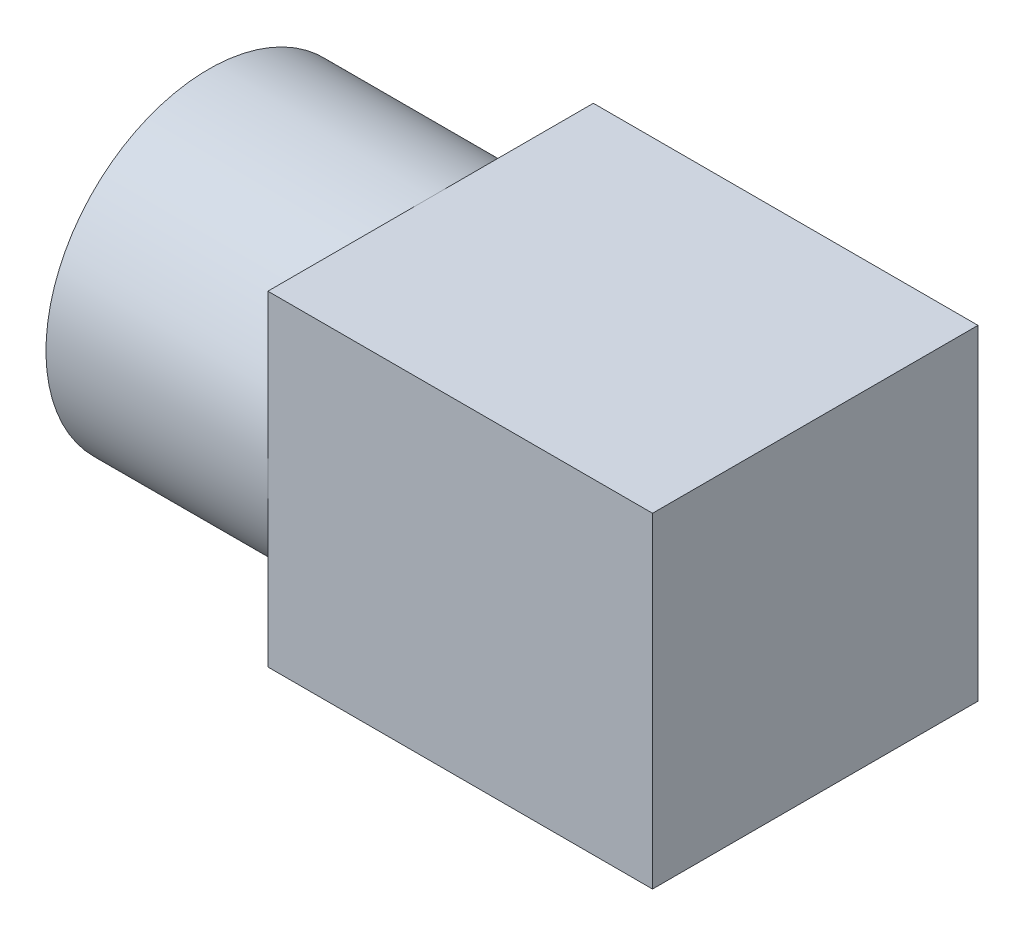
ISO-10303-21;
HEADER;
FILE_DESCRIPTION(('STEP AP214'),'2;1');
FILE_NAME('part.step','',(''),(''),'','','');
FILE_SCHEMA(('AUTOMOTIVE_DESIGN { 1 0 10303 214 1 1 1 1 }'));
ENDSEC;
DATA;
#1=APPLICATION_CONTEXT('core data for automotive mechanical design processes');
#2=APPLICATION_PROTOCOL_DEFINITION('international standard','automotive_design',2000,#1);
#3=PRODUCT_CONTEXT('',#1,'mechanical');
#4=PRODUCT('Part','Part','',(#3));
#5=PRODUCT_RELATED_PRODUCT_CATEGORY('part','',(#4));
#6=PRODUCT_DEFINITION_FORMATION('','',#4);
#7=PRODUCT_DEFINITION_CONTEXT('part definition',#1,'design');
#8=PRODUCT_DEFINITION('design','',#6,#7);
#9=PRODUCT_DEFINITION_SHAPE('','',#8);
#10=(LENGTH_UNIT() NAMED_UNIT(*) SI_UNIT(.MILLI.,.METRE.));
#11=(NAMED_UNIT(*) PLANE_ANGLE_UNIT() SI_UNIT($,.RADIAN.));
#12=(NAMED_UNIT(*) SI_UNIT($,.STERADIAN.) SOLID_ANGLE_UNIT());
#13=UNCERTAINTY_MEASURE_WITH_UNIT(LENGTH_MEASURE(1.E-05),#10,'distance_accuracy_value','');
#14=(GEOMETRIC_REPRESENTATION_CONTEXT(3) GLOBAL_UNCERTAINTY_ASSIGNED_CONTEXT((#13)) GLOBAL_UNIT_ASSIGNED_CONTEXT((#10,
#11,#12)) REPRESENTATION_CONTEXT('',''));
#15=CARTESIAN_POINT('',(0.,0.,0.));
#16=DIRECTION('',(0.,0.,1.));
#17=DIRECTION('',(1.,0.,0.));
#18=AXIS2_PLACEMENT_3D('',#15,#16,#17);
#19=CARTESIAN_POINT('',(159.831144743786,87.6716742459515,126.819588846238));
#20=DIRECTION('',(-1.,0.,0.));
#21=DIRECTION('',(0.,0.,1.));
#22=AXIS2_PLACEMENT_3D('',#19,#20,#21);
#23=PLANE('',#22);
#24=DIRECTION('',(0.,0.,-1.));
#25=VECTOR('',#24,1.);
#26=CARTESIAN_POINT('',(159.831144743785,109.671674245952,148.819588846238));
#27=LINE('',#26,#25);
#28=CARTESIAN_POINT('',(159.831144743785,109.671674245952,148.819588846238));
#29=VERTEX_POINT('',#28);
#30=CARTESIAN_POINT('',(159.831144743785,109.671674245952,137.819588846238));
#31=VERTEX_POINT('',#30);
#32=EDGE_CURVE('E132',#29,#31,#27,.T.);
#33=ORIENTED_EDGE('',*,*,#32,.T.);
#34=CARTESIAN_POINT('',(159.831144743785,98.6716742459516,137.819588846238));
#35=DIRECTION('',(1.,0.,0.));
#36=DIRECTION('',(0.,1.,0.));
#37=AXIS2_PLACEMENT_3D('',#34,#35,#36);
#38=CIRCLE('',#37,11.);
#39=CARTESIAN_POINT('',(159.831144743785,98.6716742459517,148.819588846238));
#40=VERTEX_POINT('',#39);
#41=EDGE_CURVE('E69',#31,#40,#38,.T.);
#42=ORIENTED_EDGE('',*,*,#41,.T.);
#43=DIRECTION('',(0.,1.,0.));
#44=VECTOR('',#43,1.);
#45=CARTESIAN_POINT('',(159.831144743785,87.6716742459517,148.819588846238));
#46=LINE('',#45,#44);
#47=EDGE_CURVE('E129',#40,#29,#46,.T.);
#48=ORIENTED_EDGE('',*,*,#47,.T.);
#49=EDGE_LOOP('',(#33,#42,#48));
#50=FACE_BOUND('',#49,.T.);
#51=ADVANCED_FACE('F57',(#50),#23,.T.);
#52=CARTESIAN_POINT('',(159.831144743785,87.6716742459517,148.819588846238));
#53=VERTEX_POINT('',#52);
#54=EDGE_CURVE('E141',#53,#40,#46,.T.);
#55=ORIENTED_EDGE('',*,*,#54,.T.);
#56=CARTESIAN_POINT('',(159.831144743785,87.6716742459516,137.819588846238));
#57=VERTEX_POINT('',#56);
#58=EDGE_CURVE('E11',#40,#57,#38,.T.);
#59=ORIENTED_EDGE('',*,*,#58,.T.);
#60=DIRECTION('',(0.,0.,1.));
#61=VECTOR('',#60,1.);
#62=CARTESIAN_POINT('',(159.831144743786,87.6716742459515,126.819588846238));
#63=LINE('',#62,#61);
#64=EDGE_CURVE('E146',#57,#53,#63,.T.);
#65=ORIENTED_EDGE('',*,*,#64,.T.);
#66=EDGE_LOOP('',(#55,#59,#65));
#67=FACE_BOUND('',#66,.T.);
#68=ADVANCED_FACE('F145',(#67),#23,.T.);
#69=CARTESIAN_POINT('',(159.831144743786,87.6716742459515,126.819588846238));
#70=VERTEX_POINT('',#69);
#71=EDGE_CURVE('E143',#70,#57,#63,.T.);
#72=ORIENTED_EDGE('',*,*,#71,.T.);
#73=CARTESIAN_POINT('',(159.831144743786,98.6716742459515,126.819588846238));
#74=VERTEX_POINT('',#73);
#75=EDGE_CURVE('E67',#57,#74,#38,.T.);
#76=ORIENTED_EDGE('',*,*,#75,.T.);
#77=DIRECTION('',(0.,-1.,0.));
#78=VECTOR('',#77,1.);
#79=CARTESIAN_POINT('',(159.831144743786,109.671674245952,126.819588846238));
#80=LINE('',#79,#78);
#81=EDGE_CURVE('E113',#74,#70,#80,.T.);
#82=ORIENTED_EDGE('',*,*,#81,.T.);
#83=EDGE_LOOP('',(#72,#76,#82));
#84=FACE_BOUND('',#83,.T.);
#85=ADVANCED_FACE('F204',(#84),#23,.T.);
#86=CARTESIAN_POINT('',(159.831144743786,109.671674245952,126.819588846238));
#87=VERTEX_POINT('',#86);
#88=EDGE_CURVE('E151',#87,#74,#80,.T.);
#89=ORIENTED_EDGE('',*,*,#88,.T.);
#90=EDGE_CURVE('E136',#74,#31,#38,.T.);
#91=ORIENTED_EDGE('',*,*,#90,.T.);
#92=EDGE_CURVE('E83',#31,#87,#27,.T.);
#93=ORIENTED_EDGE('',*,*,#92,.T.);
#94=EDGE_LOOP('',(#89,#91,#93));
#95=FACE_BOUND('',#94,.T.);
#96=ADVANCED_FACE('F200',(#95),#23,.T.);
#97=CARTESIAN_POINT('',(185.831144743786,87.6716742459515,126.819588846238));
#98=DIRECTION('',(-1.,0.,0.));
#99=DIRECTION('',(0.,0.,1.));
#100=AXIS2_PLACEMENT_3D('',#97,#98,#99);
#101=PLANE('',#100);
#102=DIRECTION('',(0.,0.,-1.));
#103=VECTOR('',#102,1.);
#104=CARTESIAN_POINT('',(185.831144743785,109.671674245952,137.819588846238));
#105=LINE('',#104,#103);
#106=CARTESIAN_POINT('',(185.831144743785,109.671674245952,148.819588846238));
#107=VERTEX_POINT('',#106);
#108=CARTESIAN_POINT('',(185.831144743786,109.671674245952,126.819588846238));
#109=VERTEX_POINT('',#108);
#110=EDGE_CURVE('E105',#107,#109,#105,.T.);
#111=ORIENTED_EDGE('',*,*,#110,.F.);
#112=DIRECTION('',(0.,1.,0.));
#113=VECTOR('',#112,1.);
#114=CARTESIAN_POINT('',(185.831144743785,98.6716742459517,148.819588846238));
#115=LINE('',#114,#113);
#116=CARTESIAN_POINT('',(185.831144743785,87.6716742459517,148.819588846238));
#117=VERTEX_POINT('',#116);
#118=EDGE_CURVE('E157',#117,#107,#115,.T.);
#119=ORIENTED_EDGE('',*,*,#118,.F.);
#120=DIRECTION('',(0.,0.,1.));
#121=VECTOR('',#120,1.);
#122=CARTESIAN_POINT('',(185.831144743785,87.6716742459516,137.819588846238));
#123=LINE('',#122,#121);
#124=CARTESIAN_POINT('',(185.831144743786,87.6716742459515,126.819588846238));
#125=VERTEX_POINT('',#124);
#126=EDGE_CURVE('E154',#125,#117,#123,.T.);
#127=ORIENTED_EDGE('',*,*,#126,.F.);
#128=DIRECTION('',(0.,-1.,0.));
#129=VECTOR('',#128,1.);
#130=CARTESIAN_POINT('',(185.831144743786,109.671674245952,126.819588846238));
#131=LINE('',#130,#129);
#132=EDGE_CURVE('E162',#109,#125,#131,.T.);
#133=ORIENTED_EDGE('',*,*,#132,.F.);
#134=EDGE_LOOP('',(#111,#119,#127,#133));
#135=FACE_BOUND('',#134,.T.);
#136=ADVANCED_FACE('F208',(#135),#101,.F.);
#137=CARTESIAN_POINT('',(159.831144743785,87.6716742459516,137.819588846238));
#138=DIRECTION('',(0.,1.,0.));
#139=DIRECTION('',(0.,0.,-1.));
#140=AXIS2_PLACEMENT_3D('',#137,#138,#139);
#141=PLANE('',#140);
#142=ORIENTED_EDGE('',*,*,#126,.T.);
#143=DIRECTION('',(1.,0.,0.));
#144=VECTOR('',#143,1.);
#145=CARTESIAN_POINT('',(159.831144743785,87.6716742459517,148.819588846238));
#146=LINE('',#145,#144);
#147=EDGE_CURVE('E166',#53,#117,#146,.T.);
#148=ORIENTED_EDGE('',*,*,#147,.F.);
#149=ORIENTED_EDGE('',*,*,#64,.F.);
#150=ORIENTED_EDGE('',*,*,#71,.F.);
#151=DIRECTION('',(1.,0.,0.));
#152=VECTOR('',#151,1.);
#153=CARTESIAN_POINT('',(159.831144743786,87.6716742459515,126.819588846238));
#154=LINE('',#153,#152);
#155=EDGE_CURVE('E61',#70,#125,#154,.T.);
#156=ORIENTED_EDGE('',*,*,#155,.T.);
#157=EDGE_LOOP('',(#142,#148,#149,#150,#156));
#158=FACE_BOUND('',#157,.T.);
#159=ADVANCED_FACE('F59',(#158),#141,.F.);
#160=CARTESIAN_POINT('',(159.831144743785,98.6716742459517,148.819588846238));
#161=DIRECTION('',(0.,0.,-1.));
#162=DIRECTION('',(0.,-1.,0.));
#163=AXIS2_PLACEMENT_3D('',#160,#161,#162);
#164=PLANE('',#163);
#165=ORIENTED_EDGE('',*,*,#118,.T.);
#166=DIRECTION('',(1.,0.,0.));
#167=VECTOR('',#166,1.);
#168=CARTESIAN_POINT('',(159.831144743785,109.671674245952,148.819588846238));
#169=LINE('',#168,#167);
#170=EDGE_CURVE('E142',#29,#107,#169,.T.);
#171=ORIENTED_EDGE('',*,*,#170,.F.);
#172=ORIENTED_EDGE('',*,*,#47,.F.);
#173=ORIENTED_EDGE('',*,*,#54,.F.);
#174=ORIENTED_EDGE('',*,*,#147,.T.);
#175=EDGE_LOOP('',(#165,#171,#172,#173,#174));
#176=FACE_BOUND('',#175,.T.);
#177=ADVANCED_FACE('F139',(#176),#164,.F.);
#178=CARTESIAN_POINT('',(159.831144743785,109.671674245952,137.819588846238));
#179=DIRECTION('',(0.,-1.,0.));
#180=DIRECTION('',(0.,0.,1.));
#181=AXIS2_PLACEMENT_3D('',#178,#179,#180);
#182=PLANE('',#181);
#183=ORIENTED_EDGE('',*,*,#110,.T.);
#184=DIRECTION('',(1.,0.,0.));
#185=VECTOR('',#184,1.);
#186=CARTESIAN_POINT('',(159.831144743786,109.671674245952,126.819588846238));
#187=LINE('',#186,#185);
#188=EDGE_CURVE('E153',#87,#109,#187,.T.);
#189=ORIENTED_EDGE('',*,*,#188,.F.);
#190=ORIENTED_EDGE('',*,*,#92,.F.);
#191=ORIENTED_EDGE('',*,*,#32,.F.);
#192=ORIENTED_EDGE('',*,*,#170,.T.);
#193=EDGE_LOOP('',(#183,#189,#190,#191,#192));
#194=FACE_BOUND('',#193,.T.);
#195=ADVANCED_FACE('F223',(#194),#182,.F.);
#196=CARTESIAN_POINT('',(159.831144743786,109.671674245952,126.819588846238));
#197=DIRECTION('',(0.,0.,1.));
#198=DIRECTION('',(0.,1.,0.));
#199=AXIS2_PLACEMENT_3D('',#196,#197,#198);
#200=PLANE('',#199);
#201=ORIENTED_EDGE('',*,*,#132,.T.);
#202=ORIENTED_EDGE('',*,*,#155,.F.);
#203=ORIENTED_EDGE('',*,*,#81,.F.);
#204=ORIENTED_EDGE('',*,*,#88,.F.);
#205=ORIENTED_EDGE('',*,*,#188,.T.);
#206=EDGE_LOOP('',(#201,#202,#203,#204,#205));
#207=FACE_BOUND('',#206,.T.);
#208=ADVANCED_FACE('F216',(#207),#200,.F.);
#209=CARTESIAN_POINT('',(144.831144743785,98.6716742459516,137.819588846238));
#210=DIRECTION('',(1.,0.,0.));
#211=DIRECTION('',(0.,0.,-1.));
#212=AXIS2_PLACEMENT_3D('',#209,#210,#211);
#213=CYLINDRICAL_SURFACE('',#212,11.);
#214=CARTESIAN_POINT('',(144.831144743785,98.6716742459516,137.819588846238));
#215=DIRECTION('',(1.,0.,0.));
#216=DIRECTION('',(0.,-1.,0.));
#217=AXIS2_PLACEMENT_3D('',#214,#215,#216);
#218=CIRCLE('',#217,11.);
#219=CARTESIAN_POINT('',(144.831144743785,87.6716742459516,137.819588846238));
#220=VERTEX_POINT('',#219);
#221=EDGE_CURVE('E134',#220,#220,#218,.T.);
#222=ORIENTED_EDGE('',*,*,#221,.T.);
#223=EDGE_LOOP('',(#222));
#224=FACE_BOUND('',#223,.T.);
#225=ORIENTED_EDGE('',*,*,#41,.F.);
#226=ORIENTED_EDGE('',*,*,#90,.F.);
#227=ORIENTED_EDGE('',*,*,#75,.F.);
#228=ORIENTED_EDGE('',*,*,#58,.F.);
#229=EDGE_LOOP('',(#225,#226,#227,#228));
#230=FACE_BOUND('',#229,.T.);
#231=ADVANCED_FACE('F122',(#224,#230),#213,.T.);
#232=CARTESIAN_POINT('',(144.831144743785,98.6716742459516,137.819588846238));
#233=DIRECTION('',(1.,0.,0.));
#234=DIRECTION('',(0.,0.,-1.));
#235=AXIS2_PLACEMENT_3D('',#232,#233,#234);
#236=PLANE('',#235);
#237=CARTESIAN_POINT('',(144.831144743785,98.6716742459516,137.819588846238));
#238=DIRECTION('',(1.,0.,0.));
#239=DIRECTION('',(0.,0.,1.));
#240=AXIS2_PLACEMENT_3D('',#237,#238,#239);
#241=CIRCLE('',#240,7.475);
#242=CARTESIAN_POINT('',(144.831144743785,98.6716742459516,145.294588846238));
#243=VERTEX_POINT('',#242);
#244=EDGE_CURVE('E179',#243,#243,#241,.T.);
#245=ORIENTED_EDGE('',*,*,#244,.T.);
#246=EDGE_LOOP('',(#245));
#247=FACE_BOUND('',#246,.T.);
#248=ORIENTED_EDGE('',*,*,#221,.F.);
#249=EDGE_LOOP('',(#248));
#250=FACE_BOUND('',#249,.T.);
#251=ADVANCED_FACE('F183',(#247,#250),#236,.F.);
#252=CARTESIAN_POINT('',(159.831144743785,98.6716742459516,137.819588846238));
#253=DIRECTION('',(1.,0.,0.));
#254=DIRECTION('',(0.,0.,-1.));
#255=AXIS2_PLACEMENT_3D('',#252,#253,#254);
#256=PLANE('',#255);
#257=CARTESIAN_POINT('',(159.831144743785,98.6716742459516,137.819588846238));
#258=DIRECTION('',(-1.,0.,0.));
#259=DIRECTION('',(0.,0.,1.));
#260=AXIS2_PLACEMENT_3D('',#257,#258,#259);
#261=CIRCLE('',#260,7.475);
#262=CARTESIAN_POINT('',(159.831144743785,98.6716742459516,145.294588846238));
#263=VERTEX_POINT('',#262);
#264=EDGE_CURVE('E135',#263,#263,#261,.T.);
#265=ORIENTED_EDGE('',*,*,#264,.T.);
#266=EDGE_LOOP('',(#265));
#267=FACE_BOUND('',#266,.T.);
#268=ADVANCED_FACE('F188',(#267),#256,.F.);
#269=CARTESIAN_POINT('',(144.831144743785,98.6716742459516,137.819588846238));
#270=DIRECTION('',(1.,0.,0.));
#271=DIRECTION('',(0.,0.,1.));
#272=AXIS2_PLACEMENT_3D('',#269,#270,#271);
#273=CYLINDRICAL_SURFACE('',#272,7.475);
#274=ORIENTED_EDGE('',*,*,#264,.F.);
#275=EDGE_LOOP('',(#274));
#276=FACE_BOUND('',#275,.T.);
#277=ORIENTED_EDGE('',*,*,#244,.F.);
#278=EDGE_LOOP('',(#277));
#279=FACE_BOUND('',#278,.T.);
#280=ADVANCED_FACE('F186',(#276,#279),#273,.F.);
#281=CLOSED_SHELL('',(#51,#68,#85,#96,#136,#159,#177,#195,#208,#231,#251,#268,#280));
#282=MANIFOLD_SOLID_BREP('B2',#281);
#283=ADVANCED_BREP_SHAPE_REPRESENTATION('',(#18,#282),#14);
#284=SHAPE_DEFINITION_REPRESENTATION(#9,#283);
ENDSEC;
END-ISO-10303-21;
